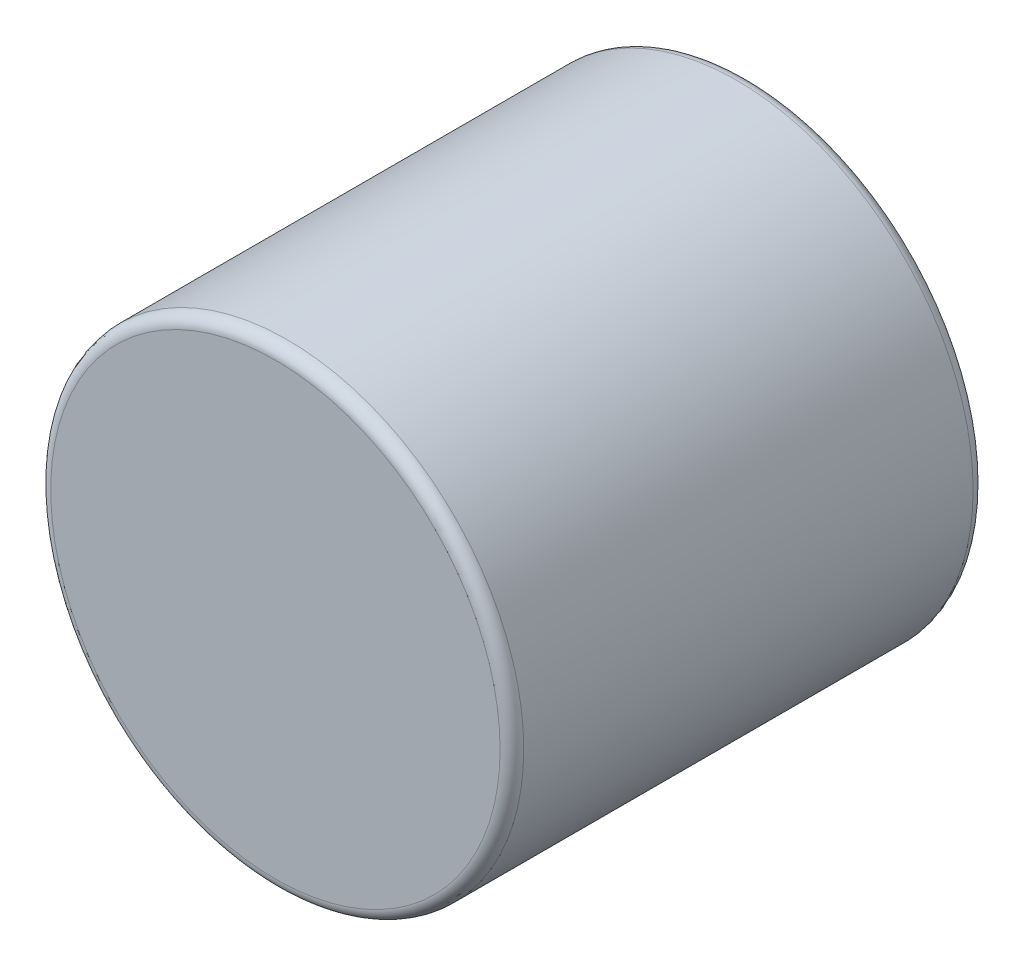
ISO-10303-21;
HEADER;
FILE_DESCRIPTION(('STEP AP214'),'2;1');
FILE_NAME('part.step','',(''),(''),'','','');
FILE_SCHEMA(('AUTOMOTIVE_DESIGN { 1 0 10303 214 1 1 1 1 }'));
ENDSEC;
DATA;
#1=APPLICATION_CONTEXT('core data for automotive mechanical design processes');
#2=APPLICATION_PROTOCOL_DEFINITION('international standard','automotive_design',2000,#1);
#3=PRODUCT_CONTEXT('',#1,'mechanical');
#4=PRODUCT('Part','Part','',(#3));
#5=PRODUCT_RELATED_PRODUCT_CATEGORY('part','',(#4));
#6=PRODUCT_DEFINITION_FORMATION('','',#4);
#7=PRODUCT_DEFINITION_CONTEXT('part definition',#1,'design');
#8=PRODUCT_DEFINITION('design','',#6,#7);
#9=PRODUCT_DEFINITION_SHAPE('','',#8);
#10=(LENGTH_UNIT() NAMED_UNIT(*) SI_UNIT(.MILLI.,.METRE.));
#11=(NAMED_UNIT(*) PLANE_ANGLE_UNIT() SI_UNIT($,.RADIAN.));
#12=(NAMED_UNIT(*) SI_UNIT($,.STERADIAN.) SOLID_ANGLE_UNIT());
#13=UNCERTAINTY_MEASURE_WITH_UNIT(LENGTH_MEASURE(1.E-05),#10,'distance_accuracy_value','');
#14=(GEOMETRIC_REPRESENTATION_CONTEXT(3) GLOBAL_UNCERTAINTY_ASSIGNED_CONTEXT((#13)) GLOBAL_UNIT_ASSIGNED_CONTEXT((#10,
#11,#12)) REPRESENTATION_CONTEXT('',''));
#15=CARTESIAN_POINT('',(0.,0.,0.));
#16=DIRECTION('',(0.,0.,1.));
#17=DIRECTION('',(1.,0.,0.));
#18=AXIS2_PLACEMENT_3D('',#15,#16,#17);
#19=CARTESIAN_POINT('',(0.,0.,1.5875));
#20=DIRECTION('',(0.,0.,-1.));
#21=DIRECTION('',(-1.,0.,0.));
#22=AXIS2_PLACEMENT_3D('',#19,#20,#21);
#23=CYLINDRICAL_SURFACE('',#22,1.5875);
#24=CARTESIAN_POINT('',(0.,0.,-1.508125));
#25=DIRECTION('',(0.,0.,1.));
#26=DIRECTION('',(1.,0.,0.));
#27=AXIS2_PLACEMENT_3D('',#24,#25,#26);
#28=CIRCLE('',#27,1.5875);
#29=CARTESIAN_POINT('',(1.5875,0.,-1.508125));
#30=VERTEX_POINT('',#29);
#31=EDGE_CURVE('E50',#30,#30,#28,.T.);
#32=ORIENTED_EDGE('',*,*,#31,.T.);
#33=EDGE_LOOP('',(#32));
#34=FACE_BOUND('',#33,.T.);
#35=CARTESIAN_POINT('',(0.,0.,1.508125));
#36=DIRECTION('',(0.,0.,1.));
#37=DIRECTION('',(1.,0.,0.));
#38=AXIS2_PLACEMENT_3D('',#35,#36,#37);
#39=CIRCLE('',#38,1.5875);
#40=CARTESIAN_POINT('',(1.5875,0.,1.508125));
#41=VERTEX_POINT('',#40);
#42=EDGE_CURVE('E54',#41,#41,#39,.F.);
#43=ORIENTED_EDGE('',*,*,#42,.T.);
#44=EDGE_LOOP('',(#43));
#45=FACE_BOUND('',#44,.T.);
#46=ADVANCED_FACE('F39',(#34,#45),#23,.T.);
#47=CARTESIAN_POINT('',(0.,0.,1.5875));
#48=DIRECTION('',(0.,0.,1.));
#49=DIRECTION('',(1.,0.,0.));
#50=AXIS2_PLACEMENT_3D('',#47,#48,#49);
#51=PLANE('',#50);
#52=CARTESIAN_POINT('',(0.,0.,1.5875));
#53=DIRECTION('',(0.,0.,1.));
#54=DIRECTION('',(1.,0.,0.));
#55=AXIS2_PLACEMENT_3D('',#52,#53,#54);
#56=CIRCLE('',#55,1.508125);
#57=CARTESIAN_POINT('',(1.508125,0.,1.5875));
#58=VERTEX_POINT('',#57);
#59=EDGE_CURVE('E10',#58,#58,#56,.T.);
#60=ORIENTED_EDGE('',*,*,#59,.T.);
#61=EDGE_LOOP('',(#60));
#62=FACE_BOUND('',#61,.T.);
#63=ADVANCED_FACE('F70',(#62),#51,.T.);
#64=CARTESIAN_POINT('',(0.,0.,-1.5875));
#65=DIRECTION('',(0.,0.,1.));
#66=DIRECTION('',(1.,0.,0.));
#67=AXIS2_PLACEMENT_3D('',#64,#65,#66);
#68=PLANE('',#67);
#69=CARTESIAN_POINT('',(0.,0.,-1.5875));
#70=DIRECTION('',(0.,0.,1.));
#71=DIRECTION('',(1.,0.,0.));
#72=AXIS2_PLACEMENT_3D('',#69,#70,#71);
#73=CIRCLE('',#72,1.508125);
#74=CARTESIAN_POINT('',(1.508125,0.,-1.5875));
#75=VERTEX_POINT('',#74);
#76=EDGE_CURVE('E46',#75,#75,#73,.F.);
#77=ORIENTED_EDGE('',*,*,#76,.T.);
#78=EDGE_LOOP('',(#77));
#79=FACE_BOUND('',#78,.T.);
#80=ADVANCED_FACE('F67',(#79),#68,.F.);
#81=CARTESIAN_POINT('',(0.,0.,-1.508125));
#82=DIRECTION('',(0.,0.,1.));
#83=DIRECTION('',(1.,0.,0.));
#84=AXIS2_PLACEMENT_3D('',#81,#82,#83);
#85=TOROIDAL_SURFACE('',#84,1.508125,0.079375);
#86=ORIENTED_EDGE('',*,*,#76,.F.);
#87=EDGE_LOOP('',(#86));
#88=FACE_BOUND('',#87,.T.);
#89=ORIENTED_EDGE('',*,*,#31,.F.);
#90=EDGE_LOOP('',(#89));
#91=FACE_BOUND('',#90,.T.);
#92=ADVANCED_FACE('F63',(#88,#91),#85,.T.);
#93=CARTESIAN_POINT('',(0.,0.,1.508125));
#94=DIRECTION('',(0.,0.,1.));
#95=DIRECTION('',(1.,0.,0.));
#96=AXIS2_PLACEMENT_3D('',#93,#94,#95);
#97=TOROIDAL_SURFACE('',#96,1.508125,0.079375);
#98=ORIENTED_EDGE('',*,*,#42,.F.);
#99=EDGE_LOOP('',(#98));
#100=FACE_BOUND('',#99,.T.);
#101=ORIENTED_EDGE('',*,*,#59,.F.);
#102=EDGE_LOOP('',(#101));
#103=FACE_BOUND('',#102,.T.);
#104=ADVANCED_FACE('F41',(#100,#103),#97,.T.);
#105=CLOSED_SHELL('',(#46,#63,#80,#92,#104));
#106=MANIFOLD_SOLID_BREP('B2',#105);
#107=ADVANCED_BREP_SHAPE_REPRESENTATION('',(#18,#106),#14);
#108=SHAPE_DEFINITION_REPRESENTATION(#9,#107);
ENDSEC;
END-ISO-10303-21;
